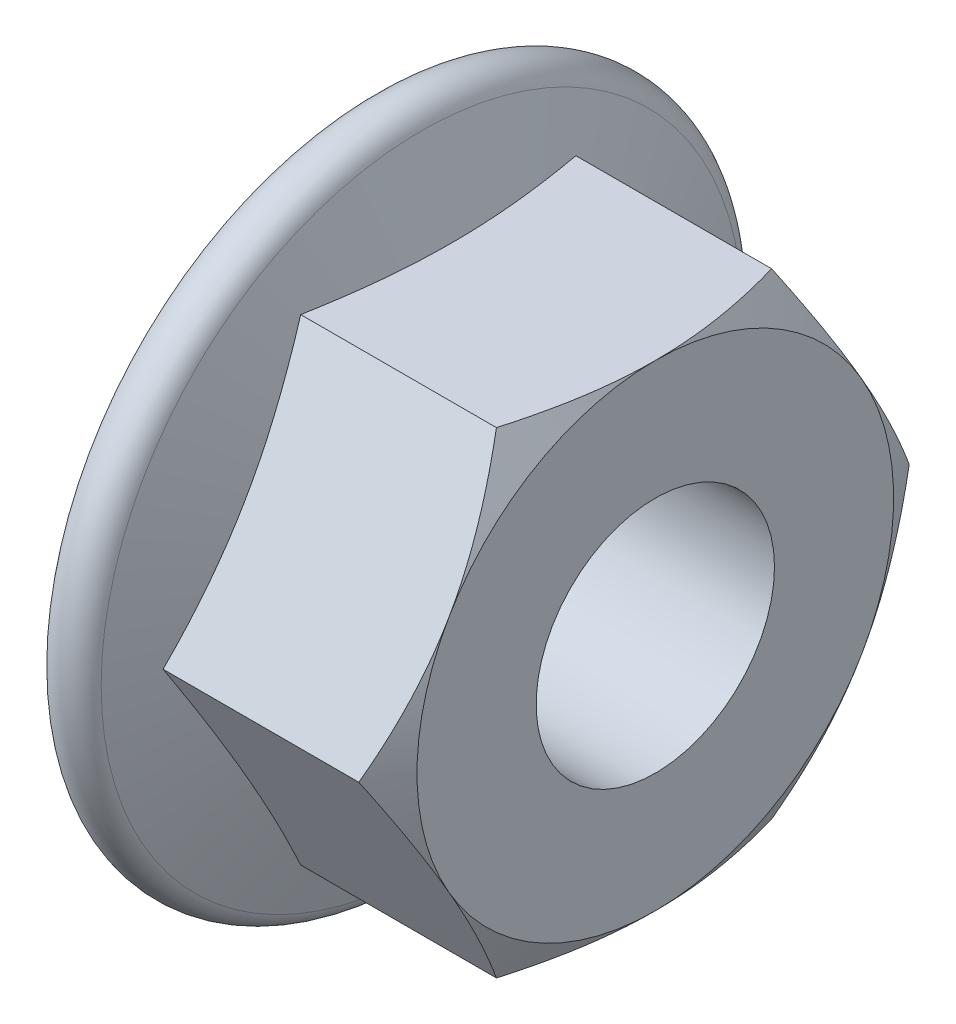
ISO-10303-21;
HEADER;
FILE_DESCRIPTION(('STEP AP214'),'2;1');
FILE_NAME('part.step','',(''),(''),'','','');
FILE_SCHEMA(('AUTOMOTIVE_DESIGN { 1 0 10303 214 1 1 1 1 }'));
ENDSEC;
DATA;
#1=APPLICATION_CONTEXT('core data for automotive mechanical design processes');
#2=APPLICATION_PROTOCOL_DEFINITION('international standard','automotive_design',2000,#1);
#3=PRODUCT_CONTEXT('',#1,'mechanical');
#4=PRODUCT('Part','Part','',(#3));
#5=PRODUCT_RELATED_PRODUCT_CATEGORY('part','',(#4));
#6=PRODUCT_DEFINITION_FORMATION('','',#4);
#7=PRODUCT_DEFINITION_CONTEXT('part definition',#1,'design');
#8=PRODUCT_DEFINITION('design','',#6,#7);
#9=PRODUCT_DEFINITION_SHAPE('','',#8);
#10=(LENGTH_UNIT() NAMED_UNIT(*) SI_UNIT(.MILLI.,.METRE.));
#11=(NAMED_UNIT(*) PLANE_ANGLE_UNIT() SI_UNIT($,.RADIAN.));
#12=(NAMED_UNIT(*) SI_UNIT($,.STERADIAN.) SOLID_ANGLE_UNIT());
#13=UNCERTAINTY_MEASURE_WITH_UNIT(LENGTH_MEASURE(1.E-05),#10,'distance_accuracy_value','');
#14=(GEOMETRIC_REPRESENTATION_CONTEXT(3) GLOBAL_UNCERTAINTY_ASSIGNED_CONTEXT((#13)) GLOBAL_UNIT_ASSIGNED_CONTEXT((#10,
#11,#12)) REPRESENTATION_CONTEXT('',''));
#15=CARTESIAN_POINT('',(0.,0.,0.));
#16=DIRECTION('',(0.,0.,1.));
#17=DIRECTION('',(1.,0.,0.));
#18=AXIS2_PLACEMENT_3D('',#15,#16,#17);
#19=CARTESIAN_POINT('',(6.,-5.,-2.88675134594813));
#20=DIRECTION('',(0.,0.5,0.866025403784439));
#21=DIRECTION('',(0.,-0.866025403784439,0.5));
#22=AXIS2_PLACEMENT_3D('',#19,#20,#21);
#23=PLANE('',#22);
#24=CARTESIAN_POINT('',(1.44695147787064,0.000200000000002036,-5.7736181619501));
#25=CARTESIAN_POINT('',(1.49048329927905,-0.206877460678997,-5.65406193428397));
#26=CARTESIAN_POINT('',(1.53008307358535,-0.414637787793837,-5.5341114534973));
#27=CARTESIAN_POINT('',(1.59975280945689,-0.831509364512721,-5.29343053646114));
#28=CARTESIAN_POINT('',(1.62981531333333,-1.04062154147157,-5.17269956480312));
#29=CARTESIAN_POINT('',(1.67844057362469,-1.45787607511845,-4.93179754748151));
#30=CARTESIAN_POINT('',(1.69710939255334,-1.66600890201676,-4.81163200384457));
#31=CARTESIAN_POINT('',(1.72214953135251,-2.08276129389805,-4.57101989820648));
#32=CARTESIAN_POINT('',(1.728525462769,-2.29138064694903,-4.45057345856434));
#33=CARTESIAN_POINT('',(1.728525462769,-2.70861935305097,-4.20968057928005));
#34=CARTESIAN_POINT('',(1.72214953135251,-2.91723870610194,-4.0892341396379));
#35=CARTESIAN_POINT('',(1.69710939255334,-3.33399109798324,-3.84862203399982));
#36=CARTESIAN_POINT('',(1.67844057362469,-3.54212392488155,-3.72845649036288));
#37=CARTESIAN_POINT('',(1.62981531333333,-3.95937845852842,-3.48755447304127));
#38=CARTESIAN_POINT('',(1.59975280945689,-4.16849063548728,-3.36682350138324));
#39=CARTESIAN_POINT('',(1.53008307358535,-4.58536221220616,-3.12614258434709));
#40=CARTESIAN_POINT('',(1.49048329927905,-4.793122539321,-3.00619210356042));
#41=CARTESIAN_POINT('',(1.44695147787064,-5.0002,-2.88663587589429));
#42=B_SPLINE_CURVE_WITH_KNOTS('',3,(#24,#25,#26,#27,#28,#29,#30,#31,#32,#33,#34,#35,#36,#37,#38,
#39,#40,#41),.UNSPECIFIED.,.F.,.F.,(4,2,2,2,2,2,2,2,4),(0.,0.729203512834577,1.45897583043699,
2.18184682225058,2.90444658389739,3.6270463455442,4.3499173373578,5.07968965496021,
5.80889316779478),.UNSPECIFIED.);
#43=CARTESIAN_POINT('',(1.44699350679399,0.,-5.77350269189626));
#44=VERTEX_POINT('',#43);
#45=CARTESIAN_POINT('',(1.44699350679399,-5.,-2.88675134594813));
#46=VERTEX_POINT('',#45);
#47=EDGE_CURVE('E50',#44,#46,#42,.T.);
#48=ORIENTED_EDGE('',*,*,#47,.F.);
#49=DIRECTION('',(-1.,0.,0.));
#50=VECTOR('',#49,1.);
#51=CARTESIAN_POINT('',(6.,0.,-5.77350269189626));
#52=LINE('',#51,#50);
#53=CARTESIAN_POINT('',(5.5534180126148,0.,-5.77350269189626));
#54=VERTEX_POINT('',#53);
#55=EDGE_CURVE('E11',#54,#44,#52,.T.);
#56=ORIENTED_EDGE('',*,*,#55,.F.);
#57=CARTESIAN_POINT('',(5.55335134394817,0.000200000000002,-5.7736181619501));
#58=CARTESIAN_POINT('',(5.62661343236236,-0.219534594525183,-5.64675433465071));
#59=CARTESIAN_POINT('',(5.69324867808191,-0.441148584459579,-5.5188054379059));
#60=CARTESIAN_POINT('',(5.80956100898919,-0.888213995453512,-5.26069210252318));
#61=CARTESIAN_POINT('',(5.85919695008421,-1.11367335959077,-5.13052307794721));
#62=CARTESIAN_POINT('',(5.9364489745813,-1.56183230522351,-4.87177839004641));
#63=CARTESIAN_POINT('',(5.96457962171651,-1.78446209310419,-4.74324302208387));
#64=CARTESIAN_POINT('',(5.98980507804632,-2.11918990184664,-4.54998783160116));
#65=CARTESIAN_POINT('',(5.99538654023052,-2.23084219680506,-4.48552534905128));
#66=CARTESIAN_POINT('',(6.00079778324853,-2.4542499706738,-4.35654081066911));
#67=CARTESIAN_POINT('',(6.0006277417418,-2.56600544629031,-4.2920187567385));
#68=CARTESIAN_POINT('',(5.99224636820796,-2.87218423085064,-4.11524635305244));
#69=CARTESIAN_POINT('',(5.97817022810275,-3.06650608596721,-4.00305457769146));
#70=CARTESIAN_POINT('',(5.93353474289057,-3.45386010199771,-3.77941563226457));
#71=CARTESIAN_POINT('',(5.90296013985249,-3.64689090137157,-3.66796924828419));
#72=CARTESIAN_POINT('',(5.82653150637884,-4.03502534247485,-3.44387972423144));
#73=CARTESIAN_POINT('',(5.78035362112132,-4.23007999864173,-3.3312648659868));
#74=CARTESIAN_POINT('',(5.67554820550807,-4.61728034535877,-3.10771464157941));
#75=CARTESIAN_POINT('',(5.61694529656263,-4.80943099540809,-2.99677641204847));
#76=CARTESIAN_POINT('',(5.55335134394817,-5.0002,-2.88663587589429));
#77=B_SPLINE_CURVE_WITH_KNOTS('',3,(#57,#58,#59,#60,#61,#62,#63,#64,#65,#66,#67,#68,#69,#70,#71,
#72,#73,#74,#75,#76),.UNSPECIFIED.,.F.,.F.,(4,2,2,2,2,2,2,2,2,4),(0.,0.79255584136309,
1.58701660053333,2.36181537487281,2.74884076077325,3.13585419177295,3.80962362599679,
4.48401723901189,5.17336882348928,5.86136694793725),.UNSPECIFIED.);
#78=CARTESIAN_POINT('',(6.,-2.5,-4.33012701892219));
#79=VERTEX_POINT('',#78);
#80=EDGE_CURVE('E373',#54,#79,#77,.T.);
#81=ORIENTED_EDGE('',*,*,#80,.T.);
#82=CARTESIAN_POINT('',(5.55341801261512,-5.,-2.88675134594862));
#83=VERTEX_POINT('',#82);
#84=EDGE_CURVE('E362',#79,#83,#77,.T.);
#85=ORIENTED_EDGE('',*,*,#84,.T.);
#86=DIRECTION('',(-1.,0.,0.));
#87=VECTOR('',#86,1.);
#88=CARTESIAN_POINT('',(6.,-5.,-2.88675134594813));
#89=LINE('',#88,#87);
#90=EDGE_CURVE('E119',#83,#46,#89,.T.);
#91=ORIENTED_EDGE('',*,*,#90,.T.);
#92=EDGE_LOOP('',(#48,#56,#81,#85,#91));
#93=FACE_BOUND('',#92,.T.);
#94=ADVANCED_FACE('F35',(#93),#23,.F.);
#95=CARTESIAN_POINT('',(6.,0.,-5.77350269189626));
#96=DIRECTION('',(0.,-0.5,0.866025403784438));
#97=DIRECTION('',(0.,-0.866025403784439,-0.5));
#98=AXIS2_PLACEMENT_3D('',#95,#96,#97);
#99=PLANE('',#98);
#100=CARTESIAN_POINT('',(1.44695147787064,5.0002,-2.88663587589429));
#101=CARTESIAN_POINT('',(1.49048329927905,4.793122539321,-3.00619210356041));
#102=CARTESIAN_POINT('',(1.53008307358535,4.58536221220616,-3.12614258434709));
#103=CARTESIAN_POINT('',(1.59975280945689,4.16849063548728,-3.36682350138324));
#104=CARTESIAN_POINT('',(1.62981531333333,3.95937845852842,-3.48755447304127));
#105=CARTESIAN_POINT('',(1.67844057362469,3.54212392488155,-3.72845649036288));
#106=CARTESIAN_POINT('',(1.69710939255334,3.33399109798324,-3.84862203399982));
#107=CARTESIAN_POINT('',(1.72214953135251,2.91723870610194,-4.0892341396379));
#108=CARTESIAN_POINT('',(1.728525462769,2.70861935305097,-4.20968057928005));
#109=CARTESIAN_POINT('',(1.728525462769,2.29138064694903,-4.45057345856434));
#110=CARTESIAN_POINT('',(1.72214953135251,2.08276129389806,-4.57101989820648));
#111=CARTESIAN_POINT('',(1.69710939255334,1.66600890201676,-4.81163200384457));
#112=CARTESIAN_POINT('',(1.67844057362469,1.45787607511845,-4.93179754748151));
#113=CARTESIAN_POINT('',(1.62981531333333,1.04062154147158,-5.17269956480312));
#114=CARTESIAN_POINT('',(1.59975280945689,0.831509364512725,-5.29343053646114));
#115=CARTESIAN_POINT('',(1.53008307358535,0.414637787793841,-5.53411145349729));
#116=CARTESIAN_POINT('',(1.49048329927905,0.206877460679002,-5.65406193428397));
#117=CARTESIAN_POINT('',(1.44695147787064,-0.000199999999997523,-5.7736181619501));
#118=B_SPLINE_CURVE_WITH_KNOTS('',3,(#100,#101,#102,#103,#104,#105,#106,#107,#108,#109,#110,
#111,#112,#113,#114,#115,#116,#117),.UNSPECIFIED.,.F.,.F.,(4,2,2,2,2,2,2,2,4),(0.,
0.729203512834577,1.45897583043699,2.18184682225058,2.90444658389739,3.6270463455442,
4.34991733735779,5.0796896549602,5.80889316779478),.UNSPECIFIED.);
#119=CARTESIAN_POINT('',(1.44699350679399,5.,-2.88675134594813));
#120=VERTEX_POINT('',#119);
#121=EDGE_CURVE('E56',#120,#44,#118,.T.);
#122=ORIENTED_EDGE('',*,*,#121,.F.);
#123=DIRECTION('',(-1.,0.,0.));
#124=VECTOR('',#123,1.);
#125=CARTESIAN_POINT('',(6.,5.,-2.88675134594813));
#126=LINE('',#125,#124);
#127=CARTESIAN_POINT('',(5.5534180126148,5.,-2.88675134594813));
#128=VERTEX_POINT('',#127);
#129=EDGE_CURVE('E43',#128,#120,#126,.T.);
#130=ORIENTED_EDGE('',*,*,#129,.F.);
#131=CARTESIAN_POINT('',(5.55335134394817,5.0002,-2.88663587589429));
#132=CARTESIAN_POINT('',(5.62661343236237,4.78046540547481,-3.01349970319368));
#133=CARTESIAN_POINT('',(5.69324867808191,4.55885141554042,-3.14144859993849));
#134=CARTESIAN_POINT('',(5.80956100898919,4.11178600454649,-3.39956193532121));
#135=CARTESIAN_POINT('',(5.85919695008421,3.88632664040923,-3.52973095989718));
#136=CARTESIAN_POINT('',(5.9364489745813,3.43816769477649,-3.78847564779798));
#137=CARTESIAN_POINT('',(5.96457962171651,3.21553790689581,-3.91701101576052));
#138=CARTESIAN_POINT('',(5.98980507804632,2.88081009815336,-4.11026620624322));
#139=CARTESIAN_POINT('',(5.99538654023052,2.76915780319494,-4.17472868879311));
#140=CARTESIAN_POINT('',(6.00079778324853,2.5457500293262,-4.30371322717528));
#141=CARTESIAN_POINT('',(6.0006277417418,2.43399455370969,-4.36823528110589));
#142=CARTESIAN_POINT('',(5.99224636820796,2.12781576914936,-4.54500768479194));
#143=CARTESIAN_POINT('',(5.97817022810275,1.93349391403279,-4.65719946015293));
#144=CARTESIAN_POINT('',(5.93353474289057,1.54613989800229,-4.88083840557981));
#145=CARTESIAN_POINT('',(5.90296013985249,1.35310909862843,-4.9922847895602));
#146=CARTESIAN_POINT('',(5.82653150637884,0.964974657525145,-5.21637431361295));
#147=CARTESIAN_POINT('',(5.78035362112132,0.769920001358264,-5.32898917185759));
#148=CARTESIAN_POINT('',(5.67554820550807,0.382719654641232,-5.55253939626498));
#149=CARTESIAN_POINT('',(5.61694529656263,0.190569004591914,-5.66347762579592));
#150=CARTESIAN_POINT('',(5.55335134394817,-0.000199999999999032,-5.7736181619501));
#151=B_SPLINE_CURVE_WITH_KNOTS('',3,(#131,#132,#133,#134,#135,#136,#137,#138,#139,#140,#141,
#142,#143,#144,#145,#146,#147,#148,#149,#150),.UNSPECIFIED.,.F.,.F.,(4,2,2,2,2,2,2,2,2,4),(0.,
0.792555841363091,1.58701660053333,2.36181537487281,2.74884076077325,3.13585419177295,
3.80962362599679,4.48401723901189,5.17336882348929,5.86136694793725),.UNSPECIFIED.);
#152=CARTESIAN_POINT('',(6.,2.5,-4.33012701892219));
#153=VERTEX_POINT('',#152);
#154=EDGE_CURVE('E360',#128,#153,#151,.T.);
#155=ORIENTED_EDGE('',*,*,#154,.T.);
#156=EDGE_CURVE('E356',#153,#54,#151,.T.);
#157=ORIENTED_EDGE('',*,*,#156,.T.);
#158=ORIENTED_EDGE('',*,*,#55,.T.);
#159=EDGE_LOOP('',(#122,#130,#155,#157,#158));
#160=FACE_BOUND('',#159,.T.);
#161=ADVANCED_FACE('F180',(#160),#99,.F.);
#162=CARTESIAN_POINT('',(6.,5.,-2.88675134594813));
#163=DIRECTION('',(0.,-1.,0.));
#164=DIRECTION('',(0.,0.,-1.));
#165=AXIS2_PLACEMENT_3D('',#162,#163,#164);
#166=PLANE('',#165);
#167=CARTESIAN_POINT('',(0.240410380733447,5.,-7.58959615984327));
#168=CARTESIAN_POINT('',(0.309005739965036,5.,-7.36384569298918));
#169=CARTESIAN_POINT('',(0.376788483884276,5.,-7.13784364484342));
#170=CARTESIAN_POINT('',(0.510278801993914,5.,-6.68520834285812));
#171=CARTESIAN_POINT('',(0.575986207460981,5.,-6.45857503931959));
#172=CARTESIAN_POINT('',(0.704987571615603,5.,-6.00415270868529));
#173=CARTESIAN_POINT('',(0.768276686874315,5.,-5.77636230158848));
#174=CARTESIAN_POINT('',(0.891686912335823,5.,-5.31992613831547));
#175=CARTESIAN_POINT('',(0.951808081104047,5.,-5.09128039803546));
#176=CARTESIAN_POINT('',(1.06731933712792,5.,-4.63605147199275));
#177=CARTESIAN_POINT('',(1.12276202276589,5.,-4.40948170004186));
#178=CARTESIAN_POINT('',(1.22884286746186,5.,-3.95522220866547));
#179=CARTESIAN_POINT('',(1.27948122516598,5.,-3.72753253595468));
#180=CARTESIAN_POINT('',(1.37476171635107,5.,-3.27096977405126));
#181=CARTESIAN_POINT('',(1.41940582815466,5.,-3.0420971013186));
#182=CARTESIAN_POINT('',(1.50132206790816,5.,-2.58302644184474));
#183=CARTESIAN_POINT('',(1.53859444868321,5.,-2.35282850083447));
#184=CARTESIAN_POINT('',(1.60055061253934,5.,-1.91709614149473));
#185=CARTESIAN_POINT('',(1.62617836997039,5.,-1.71169720602434));
#186=CARTESIAN_POINT('',(1.66938356038142,5.,-1.300047444084));
#187=CARTESIAN_POINT('',(1.68696123094219,5.,-1.09379664293629));
#188=CARTESIAN_POINT('',(1.71321907011135,5.,-0.680866570157189));
#189=CARTESIAN_POINT('',(1.72190551578435,5.,-0.474187704168648));
#190=CARTESIAN_POINT('',(1.72994348714457,5.,-0.0606464422863168));
#191=CARTESIAN_POINT('',(1.72929506312466,5.,0.146215952612682));
#192=CARTESIAN_POINT('',(1.71866806903133,5.,0.560887363316299));
#193=CARTESIAN_POINT('',(1.70863586762169,5.,0.768694982121785));
#194=CARTESIAN_POINT('',(1.67969487721076,5.,1.18368588091762));
#195=CARTESIAN_POINT('',(1.66078587096725,5.,1.39086914550323));
#196=CARTESIAN_POINT('',(1.61496450316448,5.,1.80451912755804));
#197=CARTESIAN_POINT('',(1.58804517468385,5.,2.01098506233829));
#198=CARTESIAN_POINT('',(1.52728003641189,5.,2.42288190162517));
#199=CARTESIAN_POINT('',(1.49343423871807,5.,2.6283128079389));
#200=CARTESIAN_POINT('',(1.41424688517568,5.,3.06963546378598));
#201=CARTESIAN_POINT('',(1.36793787152423,5.,3.30535232775187));
#202=CARTESIAN_POINT('',(1.26905627412394,5.,3.77547763257604));
#203=CARTESIAN_POINT('',(1.21648308868194,5.,4.00988594547648));
#204=CARTESIAN_POINT('',(1.10632504483254,5.,4.47760456738108));
#205=CARTESIAN_POINT('',(1.04873836254752,5.,4.71091444397109));
#206=CARTESIAN_POINT('',(0.929591136335446,5.,5.17650394783197));
#207=CARTESIAN_POINT('',(0.868030717162685,5.,5.40878360720176));
#208=CARTESIAN_POINT('',(0.741639900628577,5.,5.87282936457628));
#209=CARTESIAN_POINT('',(0.676804653050664,5.,6.10459413656035));
#210=CARTESIAN_POINT('',(0.544571006293116,5.,6.56739271981542));
#211=CARTESIAN_POINT('',(0.47717256801896,5.,6.79842651987916));
#212=CARTESIAN_POINT('',(0.271921216019188,5.,7.49050885313418));
#213=CARTESIAN_POINT('',(0.130983600487598,5.,7.95064170165435));
#214=CARTESIAN_POINT('',(-0.154327175359989,5.,8.86256175843402));
#215=CARTESIAN_POINT('',(-0.298621702234868,5.,9.31437377213064));
#216=CARTESIAN_POINT('',(-0.59098807599313,5.,10.2168017467589));
#217=CARTESIAN_POINT('',(-0.739060149445248,5.,10.6674176341516));
#218=CARTESIAN_POINT('',(-1.037285510531,5.,11.5658465543332));
#219=CARTESIAN_POINT('',(-1.18742737574142,5.,12.0136633895876));
#220=CARTESIAN_POINT('',(-1.48974192080514,5.,12.9085661933413));
#221=CARTESIAN_POINT('',(-1.64191441462424,5.,13.3556522246369));
#222=CARTESIAN_POINT('',(-1.79478683996488,5.,13.8024957314421));
#223=B_SPLINE_CURVE_WITH_KNOTS('',3,(#167,#168,#169,#170,#171,#172,#173,#174,#175,#176,#177,
#178,#179,#180,#181,#182,#183,#184,#185,#186,#187,#188,#189,#190,#191,#192,#193,#194,#195,#196,
#197,#198,#199,#200,#201,#202,#203,#204,#205,#206,#207,#208,#209,#210,#211,#212,#213,#214,#215,
#216,#217,#218,#219,#220,#221,#222),.UNSPECIFIED.,.F.,.F.,(4,2,2,2,2,2,2,2,2,2,2,2,2,2,2,2,2,2,
2,2,2,2,2,2,2,2,2,4),(0.,0.707830959157883,1.4157193170438,2.12495815770956,2.83418388216246,
3.53390660770378,4.23360038896179,4.93306267479613,5.63250096730801,6.25333796351582,
6.87415663589059,7.49453671714079,8.1149134560111,8.73885765625053,9.36281712708475,
9.98732087639871,10.6118235349877,11.3323825288529,12.0530107905286,12.7739023164102,
13.4947712211112,14.2167410100674,14.9387218151339,16.3823616315812,17.8052252158678,
19.2281743418802,20.645117438175,22.061931601778),.UNSPECIFIED.);
#224=CARTESIAN_POINT('',(1.44699350679399,5.,2.88675134594813));
#225=VERTEX_POINT('',#224);
#226=EDGE_CURVE('E167',#225,#120,#223,.F.);
#227=ORIENTED_EDGE('',*,*,#226,.F.);
#228=DIRECTION('',(-1.,0.,0.));
#229=VECTOR('',#228,1.);
#230=CARTESIAN_POINT('',(6.,5.,2.88675134594813));
#231=LINE('',#230,#229);
#232=CARTESIAN_POINT('',(5.5534180126148,5.,2.88675134594813));
#233=VERTEX_POINT('',#232);
#234=EDGE_CURVE('E387',#233,#225,#231,.T.);
#235=ORIENTED_EDGE('',*,*,#234,.F.);
#236=CARTESIAN_POINT('',(3.53606777790848,5.,-7.80316883937986));
#237=CARTESIAN_POINT('',(3.64243840063289,5.,-7.58429281451012));
#238=CARTESIAN_POINT('',(3.74780287408453,5.,-7.36491941565103));
#239=CARTESIAN_POINT('',(3.95595434118066,5.,-6.9249134028321));
#240=CARTESIAN_POINT('',(4.05874093737647,5.,-6.7042806010609));
#241=CARTESIAN_POINT('',(4.26167769321041,5.,-6.26037885537462));
#242=CARTESIAN_POINT('',(4.36181088826264,5.,-6.03710212934251));
#243=CARTESIAN_POINT('',(4.55804201425494,5.,-5.5887889667951));
#244=CARTESIAN_POINT('',(4.65414013303001,5.,-5.36375261277121));
#245=CARTESIAN_POINT('',(4.84425272269753,5.,-4.90427325796492));
#246=CARTESIAN_POINT('',(4.93810026031318,5.,-4.669760813791));
#247=CARTESIAN_POINT('',(5.11881045505089,5.,-4.19801090184383));
#248=CARTESIAN_POINT('',(5.20567233595843,5.,-3.96077313458294));
#249=CARTESIAN_POINT('',(5.37016800032486,5.,-3.48362276412448));
#250=CARTESIAN_POINT('',(5.44782000508509,5.,-3.24371650552178));
#251=CARTESIAN_POINT('',(5.59143735110183,5.,-2.76046376695176));
#252=CARTESIAN_POINT('',(5.65740631803894,5.,-2.51711837967746));
#253=CARTESIAN_POINT('',(5.77419170808293,5.,-2.02812819882913));
#254=CARTESIAN_POINT('',(5.82508725355427,5.,-1.78250265338299));
#255=CARTESIAN_POINT('',(5.9088543337547,5.,-1.28814793844047));
#256=CARTESIAN_POINT('',(5.94172780913601,5.,-1.0394191060634));
#257=CARTESIAN_POINT('',(5.98640065868094,5.,-0.543367110660337));
#258=CARTESIAN_POINT('',(5.99847475062826,5.,-0.296069313685915));
#259=CARTESIAN_POINT('',(6.00125141808879,5.,0.198673134405027));
#260=CARTESIAN_POINT('',(5.99195327307104,5.,0.446117790191489));
#261=CARTESIAN_POINT('',(5.958814524633,5.,0.864633163347569));
#262=CARTESIAN_POINT('',(5.94022876281716,5.,1.03614640079709));
#263=CARTESIAN_POINT('',(5.89391855067457,5.,1.37794285368106));
#264=CARTESIAN_POINT('',(5.86619290870596,5.,1.54822590576611));
#265=CARTESIAN_POINT('',(5.77076131034636,5.,2.05697626909056));
#266=CARTESIAN_POINT('',(5.69081596204524,5.,2.39317466210718));
#267=CARTESIAN_POINT('',(5.55180395744498,5.,2.89620716314616));
#268=CARTESIAN_POINT('',(5.50158447966445,5.,3.06563442620562));
#269=CARTESIAN_POINT('',(5.39584390367262,5.,3.40284249583916));
#270=CARTESIAN_POINT('',(5.3403227625058,5.,3.57062328906094));
#271=CARTESIAN_POINT('',(5.22487718771106,5.,3.90459478419822));
#272=CARTESIAN_POINT('',(5.16495403171503,5.,4.07078593178607));
#273=CARTESIAN_POINT('',(5.04141813967858,5.,4.40178114959466));
#274=CARTESIAN_POINT('',(4.97780551085333,5.,4.56658525996314));
#275=CARTESIAN_POINT('',(4.78868907584542,5.,5.04321761214102));
#276=CARTESIAN_POINT('',(4.65916015773458,5.,5.35344774258154));
#277=CARTESIAN_POINT('',(4.39212728338459,5.,5.97047015792695));
#278=CARTESIAN_POINT('',(4.25462221305608,5.,6.27726195539844));
#279=CARTESIAN_POINT('',(3.97369491093421,5.,6.88828788354801));
#280=CARTESIAN_POINT('',(3.83026995273225,5.,7.19252075628606));
#281=CARTESIAN_POINT('',(3.53904433414472,5.,7.79885706917929));
#282=CARTESIAN_POINT('',(3.391243906046,5.,8.10096062132632));
#283=CARTESIAN_POINT('',(3.09202137927656,5.,8.70405000320761));
#284=CARTESIAN_POINT('',(2.94059318273269,5.,9.00503280086994));
#285=CARTESIAN_POINT('',(2.63511968544861,5.,9.60566922109278));
#286=CARTESIAN_POINT('',(2.48107435573944,5.,9.90532282889419));
#287=CARTESIAN_POINT('',(2.17095664253258,5.,10.5034757206786));
#288=CARTESIAN_POINT('',(2.01488481543712,5.,10.8019752934812));
#289=CARTESIAN_POINT('',(1.70107767942472,5.,11.3980992373289));
#290=CARTESIAN_POINT('',(1.54334236440562,5.,11.6957236051584));
#291=CARTESIAN_POINT('',(1.10553891549485,5.,12.5172958294986));
#292=CARTESIAN_POINT('',(0.824050070420675,5.,13.0404863994554));
#293=CARTESIAN_POINT('',(0.25806272925609,5.,14.0852852868896));
#294=CARTESIAN_POINT('',(-0.0264359947545861,5.,14.6068934806386));
#295=CARTESIAN_POINT('',(-0.59661101789383,5.,15.6470173829691));
#296=CARTESIAN_POINT('',(-0.88227935894211,5.,16.1655374578931));
#297=CARTESIAN_POINT('',(-1.45528735907065,5.,17.2015921543189));
#298=CARTESIAN_POINT('',(-1.74262686397693,5.,17.7191268610575));
#299=CARTESIAN_POINT('',(-2.03056730926428,5.,18.2363247354929));
#300=B_SPLINE_CURVE_WITH_KNOTS('',3,(#236,#237,#238,#239,#240,#241,#242,#243,#244,#245,#246,
#247,#248,#249,#250,#251,#252,#253,#254,#255,#256,#257,#258,#259,#260,#261,#262,#263,#264,#265,
#266,#267,#268,#269,#270,#271,#272,#273,#274,#275,#276,#277,#278,#279,#280,#281,#282,#283,#284,
#285,#286,#287,#288,#289,#290,#291,#292,#293,#294,#295,#296,#297,#298,#299),.UNSPECIFIED.,.F.,
.F.,(4,2,2,2,2,2,2,2,2,2,2,2,2,2,2,2,2,2,2,2,2,2,2,2,2,2,2,2,2,2,2,4),(0.,0.730072267465859,
1.46025641161525,2.19433093555713,2.92837124996164,3.68606553214966,4.44384388990209,
5.2000970856125,5.9561151750262,6.70809147454211,7.45998678384695,8.20187268280229,
8.94378359362711,9.46108586718497,9.97845561241594,11.0137052032196,11.543798734101,
12.0738965603103,12.6038411352822,13.1337703179045,14.1421486511694,15.1506681729981,
16.1596574683085,17.1685932936781,18.1793640758274,19.1901460534587,20.2006561413383,
21.2111699373535,22.9934785699825,24.7759231462787,26.5519334185061,28.3277823640031),.UNSPECIFIED.);
#301=CARTESIAN_POINT('',(6.,5.,0.));
#302=VERTEX_POINT('',#301);
#303=EDGE_CURVE('E361',#233,#302,#300,.F.);
#304=ORIENTED_EDGE('',*,*,#303,.T.);
#305=EDGE_CURVE('E350',#302,#128,#300,.F.);
#306=ORIENTED_EDGE('',*,*,#305,.T.);
#307=ORIENTED_EDGE('',*,*,#129,.T.);
#308=EDGE_LOOP('',(#227,#235,#304,#306,#307));
#309=FACE_BOUND('',#308,.T.);
#310=ADVANCED_FACE('F183',(#309),#166,.F.);
#311=CARTESIAN_POINT('',(6.,5.,2.88675134594813));
#312=DIRECTION('',(0.,-0.5,-0.866025403784439));
#313=DIRECTION('',(0.,0.866025403784439,-0.5));
#314=AXIS2_PLACEMENT_3D('',#311,#312,#313);
#315=PLANE('',#314);
#316=CARTESIAN_POINT('',(1.44695147787064,-0.000200000000000837,5.7736181619501));
#317=CARTESIAN_POINT('',(1.49048329927905,0.206877460678998,5.65406193428397));
#318=CARTESIAN_POINT('',(1.53008307358535,0.414637787793838,5.53411145349729));
#319=CARTESIAN_POINT('',(1.59975280945689,0.831509364512722,5.29343053646114));
#320=CARTESIAN_POINT('',(1.62981531333333,1.04062154147157,5.17269956480312));
#321=CARTESIAN_POINT('',(1.67844057362469,1.45787607511845,4.93179754748151));
#322=CARTESIAN_POINT('',(1.69710939255334,1.66600890201676,4.81163200384457));
#323=CARTESIAN_POINT('',(1.72214953135251,2.08276129389805,4.57101989820648));
#324=CARTESIAN_POINT('',(1.728525462769,2.29138064694903,4.45057345856434));
#325=CARTESIAN_POINT('',(1.728525462769,2.70861935305097,4.20968057928005));
#326=CARTESIAN_POINT('',(1.72214953135251,2.91723870610194,4.0892341396379));
#327=CARTESIAN_POINT('',(1.69710939255334,3.33399109798324,3.84862203399982));
#328=CARTESIAN_POINT('',(1.67844057362469,3.54212392488155,3.72845649036288));
#329=CARTESIAN_POINT('',(1.62981531333333,3.95937845852842,3.48755447304127));
#330=CARTESIAN_POINT('',(1.59975280945689,4.16849063548728,3.36682350138324));
#331=CARTESIAN_POINT('',(1.53008307358535,4.58536221220616,3.12614258434709));
#332=CARTESIAN_POINT('',(1.49048329927905,4.793122539321,3.00619210356042));
#333=CARTESIAN_POINT('',(1.44695147787064,5.0002,2.88663587589429));
#334=B_SPLINE_CURVE_WITH_KNOTS('',3,(#316,#317,#318,#319,#320,#321,#322,#323,#324,#325,#326,
#327,#328,#329,#330,#331,#332,#333),.UNSPECIFIED.,.F.,.F.,(4,2,2,2,2,2,2,2,4),(0.,
0.729203512834577,1.45897583043699,2.18184682225058,2.90444658389739,3.6270463455442,
4.34991733735779,5.0796896549602,5.80889316779478),.UNSPECIFIED.);
#335=CARTESIAN_POINT('',(1.44699350679399,0.,5.77350269189626));
#336=VERTEX_POINT('',#335);
#337=EDGE_CURVE('E128',#336,#225,#334,.T.);
#338=ORIENTED_EDGE('',*,*,#337,.F.);
#339=DIRECTION('',(-1.,0.,0.));
#340=VECTOR('',#339,1.);
#341=CARTESIAN_POINT('',(6.,0.,5.77350269189626));
#342=LINE('',#341,#340);
#343=CARTESIAN_POINT('',(5.5534180126148,0.,5.77350269189626));
#344=VERTEX_POINT('',#343);
#345=EDGE_CURVE('E118',#344,#336,#342,.T.);
#346=ORIENTED_EDGE('',*,*,#345,.F.);
#347=CARTESIAN_POINT('',(5.55335134394817,-0.000200000000000837,5.7736181619501));
#348=CARTESIAN_POINT('',(5.62661343236237,0.219534594525184,5.64675433465071));
#349=CARTESIAN_POINT('',(5.69324867808191,0.44114858445958,5.5188054379059));
#350=CARTESIAN_POINT('',(5.80956100898919,0.888213995453513,5.26069210252318));
#351=CARTESIAN_POINT('',(5.85919695008421,1.11367335959077,5.13052307794721));
#352=CARTESIAN_POINT('',(5.9364489745813,1.56183230522351,4.87177839004641));
#353=CARTESIAN_POINT('',(5.96457962171651,1.78446209310419,4.74324302208387));
#354=CARTESIAN_POINT('',(5.98980507804632,2.11918990184664,4.54998783160116));
#355=CARTESIAN_POINT('',(5.99538654023052,2.23084219680506,4.48552534905128));
#356=CARTESIAN_POINT('',(6.00079778324853,2.4542499706738,4.35654081066911));
#357=CARTESIAN_POINT('',(6.0006277417418,2.56600544629031,4.2920187567385));
#358=CARTESIAN_POINT('',(5.99224636820796,2.87218423085064,4.11524635305244));
#359=CARTESIAN_POINT('',(5.97817022810275,3.06650608596721,4.00305457769146));
#360=CARTESIAN_POINT('',(5.93353474289057,3.45386010199771,3.77941563226457));
#361=CARTESIAN_POINT('',(5.90296013985249,3.64689090137157,3.66796924828418));
#362=CARTESIAN_POINT('',(5.82653150637884,4.03502534247485,3.44387972423144));
#363=CARTESIAN_POINT('',(5.78035362112132,4.23007999864174,3.3312648659868));
#364=CARTESIAN_POINT('',(5.67554820550807,4.61728034535877,3.1077146415794));
#365=CARTESIAN_POINT('',(5.61694529656263,4.80943099540809,2.99677641204847));
#366=CARTESIAN_POINT('',(5.55335134394817,5.0002,2.88663587589429));
#367=B_SPLINE_CURVE_WITH_KNOTS('',3,(#347,#348,#349,#350,#351,#352,#353,#354,#355,#356,#357,
#358,#359,#360,#361,#362,#363,#364,#365,#366),.UNSPECIFIED.,.F.,.F.,(4,2,2,2,2,2,2,2,2,4),(0.,
0.792555841363092,1.58701660053334,2.36181537487281,2.74884076077326,3.13585419177295,
3.80962362599679,4.48401723901189,5.17336882348929,5.86136694793725),.UNSPECIFIED.);
#368=CARTESIAN_POINT('',(6.,2.5,4.33012701892219));
#369=VERTEX_POINT('',#368);
#370=EDGE_CURVE('E399',#344,#369,#367,.T.);
#371=ORIENTED_EDGE('',*,*,#370,.T.);
#372=EDGE_CURVE('E344',#369,#233,#367,.T.);
#373=ORIENTED_EDGE('',*,*,#372,.T.);
#374=ORIENTED_EDGE('',*,*,#234,.T.);
#375=EDGE_LOOP('',(#338,#346,#371,#373,#374));
#376=FACE_BOUND('',#375,.T.);
#377=ADVANCED_FACE('F186',(#376),#315,.F.);
#378=CARTESIAN_POINT('',(6.,0.,5.77350269189626));
#379=DIRECTION('',(0.,0.5,-0.866025403784439));
#380=DIRECTION('',(0.,0.866025403784439,0.5));
#381=AXIS2_PLACEMENT_3D('',#378,#379,#380);
#382=PLANE('',#381);
#383=CARTESIAN_POINT('',(1.44695147787064,-5.0002,2.88663587589429));
#384=CARTESIAN_POINT('',(1.49048329927905,-4.793122539321,3.00619210356041));
#385=CARTESIAN_POINT('',(1.53008307358535,-4.58536221220616,3.12614258434709));
#386=CARTESIAN_POINT('',(1.59975280945689,-4.16849063548728,3.36682350138324));
#387=CARTESIAN_POINT('',(1.62981531333333,-3.95937845852842,3.48755447304127));
#388=CARTESIAN_POINT('',(1.67844057362469,-3.54212392488155,3.72845649036288));
#389=CARTESIAN_POINT('',(1.69710939255334,-3.33399109798324,3.84862203399982));
#390=CARTESIAN_POINT('',(1.72214953135251,-2.91723870610194,4.0892341396379));
#391=CARTESIAN_POINT('',(1.728525462769,-2.70861935305097,4.20968057928005));
#392=CARTESIAN_POINT('',(1.728525462769,-2.29138064694903,4.45057345856434));
#393=CARTESIAN_POINT('',(1.72214953135251,-2.08276129389806,4.57101989820648));
#394=CARTESIAN_POINT('',(1.69710939255334,-1.66600890201676,4.81163200384457));
#395=CARTESIAN_POINT('',(1.67844057362469,-1.45787607511845,4.93179754748151));
#396=CARTESIAN_POINT('',(1.62981531333333,-1.04062154147158,5.17269956480312));
#397=CARTESIAN_POINT('',(1.59975280945689,-0.831509364512724,5.29343053646114));
#398=CARTESIAN_POINT('',(1.53008307358535,-0.41463778779384,5.53411145349729));
#399=CARTESIAN_POINT('',(1.49048329927905,-0.206877460679001,5.65406193428397));
#400=CARTESIAN_POINT('',(1.44695147787064,0.000199999999998413,5.77361816195009));
#401=B_SPLINE_CURVE_WITH_KNOTS('',3,(#383,#384,#385,#386,#387,#388,#389,#390,#391,#392,#393,
#394,#395,#396,#397,#398,#399,#400),.UNSPECIFIED.,.F.,.F.,(4,2,2,2,2,2,2,2,4),(0.,
0.729203512834578,1.45897583043699,2.18184682225058,2.90444658389739,3.6270463455442,
4.34991733735779,5.0796896549602,5.80889316779478),.UNSPECIFIED.);
#402=CARTESIAN_POINT('',(1.44699350679399,-5.,2.88675134594813));
#403=VERTEX_POINT('',#402);
#404=EDGE_CURVE('E123',#403,#336,#401,.T.);
#405=ORIENTED_EDGE('',*,*,#404,.F.);
#406=DIRECTION('',(-1.,0.,0.));
#407=VECTOR('',#406,1.);
#408=CARTESIAN_POINT('',(6.,-5.,2.88675134594813));
#409=LINE('',#408,#407);
#410=CARTESIAN_POINT('',(5.5534180126148,-5.,2.88675134594813));
#411=VERTEX_POINT('',#410);
#412=EDGE_CURVE('E107',#411,#403,#409,.T.);
#413=ORIENTED_EDGE('',*,*,#412,.F.);
#414=CARTESIAN_POINT('',(5.55335134394817,-5.0002,2.88663587589429));
#415=CARTESIAN_POINT('',(5.62661343236237,-4.78046540547481,3.01349970319368));
#416=CARTESIAN_POINT('',(5.69324867808191,-4.55885141554042,3.14144859993849));
#417=CARTESIAN_POINT('',(5.80956100898919,-4.11178600454649,3.39956193532121));
#418=CARTESIAN_POINT('',(5.85919695008421,-3.88632664040923,3.52973095989718));
#419=CARTESIAN_POINT('',(5.9364489745813,-3.43816769477649,3.78847564779798));
#420=CARTESIAN_POINT('',(5.96457962171651,-3.21553790689581,3.91701101576052));
#421=CARTESIAN_POINT('',(5.98980507804632,-2.88081009815336,4.11026620624322));
#422=CARTESIAN_POINT('',(5.99538654023052,-2.76915780319494,4.17472868879311));
#423=CARTESIAN_POINT('',(6.00079778324853,-2.5457500293262,4.30371322717528));
#424=CARTESIAN_POINT('',(6.0006277417418,-2.43399455370969,4.36823528110589));
#425=CARTESIAN_POINT('',(5.99224636820796,-2.12781576914936,4.54500768479194));
#426=CARTESIAN_POINT('',(5.97817022810275,-1.93349391403279,4.65719946015292));
#427=CARTESIAN_POINT('',(5.93353474289057,-1.54613989800229,4.88083840557981));
#428=CARTESIAN_POINT('',(5.90296013985249,-1.35310909862843,4.9922847895602));
#429=CARTESIAN_POINT('',(5.82653150637884,-0.964974657525145,5.21637431361295));
#430=CARTESIAN_POINT('',(5.78035362112132,-0.769920001358264,5.32898917185759));
#431=CARTESIAN_POINT('',(5.67554820550807,-0.382719654641232,5.55253939626498));
#432=CARTESIAN_POINT('',(5.61694529656263,-0.190569004591913,5.66347762579592));
#433=CARTESIAN_POINT('',(5.55335134394817,0.000199999999999368,5.7736181619501));
#434=B_SPLINE_CURVE_WITH_KNOTS('',3,(#414,#415,#416,#417,#418,#419,#420,#421,#422,#423,#424,
#425,#426,#427,#428,#429,#430,#431,#432,#433),.UNSPECIFIED.,.F.,.F.,(4,2,2,2,2,2,2,2,2,4),(0.,
0.792555841363091,1.58701660053333,2.36181537487281,2.74884076077325,3.13585419177295,
3.80962362599679,4.48401723901189,5.17336882348928,5.86136694793725),.UNSPECIFIED.);
#435=CARTESIAN_POINT('',(6.,-2.5,4.33012701892219));
#436=VERTEX_POINT('',#435);
#437=EDGE_CURVE('E400',#411,#436,#434,.T.);
#438=ORIENTED_EDGE('',*,*,#437,.T.);
#439=EDGE_CURVE('E337',#436,#344,#434,.T.);
#440=ORIENTED_EDGE('',*,*,#439,.T.);
#441=ORIENTED_EDGE('',*,*,#345,.T.);
#442=EDGE_LOOP('',(#405,#413,#438,#440,#441));
#443=FACE_BOUND('',#442,.T.);
#444=ADVANCED_FACE('F124',(#443),#382,.F.);
#445=CARTESIAN_POINT('',(6.,-5.,2.88675134594813));
#446=DIRECTION('',(0.,1.,0.));
#447=DIRECTION('',(0.,0.,1.));
#448=AXIS2_PLACEMENT_3D('',#445,#446,#447);
#449=PLANE('',#448);
#450=CARTESIAN_POINT('',(0.240410380749519,-5.,-7.58959615979039));
#451=CARTESIAN_POINT('',(0.309005739980342,-5.,-7.36384569293835));
#452=CARTESIAN_POINT('',(0.376788483898816,-5.,-7.13784364479464));
#453=CARTESIAN_POINT('',(0.510278802006934,-5.,-6.68520834281344));
#454=CARTESIAN_POINT('',(0.575986207473244,-5.,-6.45857503927697));
#455=CARTESIAN_POINT('',(0.704987571626366,-5.,-6.0041527086468));
#456=CARTESIAN_POINT('',(0.768276686884333,-5.,-5.77636230155206));
#457=CARTESIAN_POINT('',(0.891686912344374,-5.,-5.31992613828321));
#458=CARTESIAN_POINT('',(0.951808081111877,-5.,-5.09128039800528));
#459=CARTESIAN_POINT('',(1.06731933713435,-5.,-4.63605147196672));
#460=CARTESIAN_POINT('',(1.12276202277165,-5.,-4.4094817000179));
#461=CARTESIAN_POINT('',(1.22884286746633,-5.,-3.95522220864565));
#462=CARTESIAN_POINT('',(1.27948122516982,-5.,-3.72753253593694));
#463=CARTESIAN_POINT('',(1.37476171635376,-5.,-3.2709697740377));
#464=CARTESIAN_POINT('',(1.41940582815681,-5.,-3.04209710130712));
#465=CARTESIAN_POINT('',(1.50132206790935,-5.,-2.58302644183749));
#466=CARTESIAN_POINT('',(1.53859444868398,-5.,-2.35282850082934));
#467=CARTESIAN_POINT('',(1.6005506125398,-5.,-1.91709614149124));
#468=CARTESIAN_POINT('',(1.62617836997087,-5.,-1.71169720602037));
#469=CARTESIAN_POINT('',(1.66938356038188,-5.,-1.30004744407905));
#470=CARTESIAN_POINT('',(1.68696123094262,-5.,-1.09379664293085));
#471=CARTESIAN_POINT('',(1.71321907011168,-5.,-0.680866570150772));
#472=CARTESIAN_POINT('',(1.72190551578459,-5.,-0.474187704161743));
#473=CARTESIAN_POINT('',(1.72994348714461,-5.,-0.0606464422784395));
#474=CARTESIAN_POINT('',(1.72929506312458,-5.,0.146215952621044));
#475=CARTESIAN_POINT('',(1.71866806903095,-5.,0.560887363325643));
#476=CARTESIAN_POINT('',(1.70863586762115,-5.,0.768694982131627));
#477=CARTESIAN_POINT('',(1.67969487720986,-5.,1.18368588092844));
#478=CARTESIAN_POINT('',(1.66078587096615,-5.,1.39086914551455));
#479=CARTESIAN_POINT('',(1.61496450316297,-5.,1.80451912757033));
#480=CARTESIAN_POINT('',(1.58804517468212,-5.,2.01098506235107));
#481=CARTESIAN_POINT('',(1.52728003640971,-5.,2.42288190163891));
#482=CARTESIAN_POINT('',(1.49343423871566,-5.,2.62831280795311));
#483=CARTESIAN_POINT('',(1.41424688517288,-5.,3.06963546380067));
#484=CARTESIAN_POINT('',(1.36793787152127,-5.,3.30535232776657));
#485=CARTESIAN_POINT('',(1.26905627412071,-5.,3.77547763259076));
#486=CARTESIAN_POINT('',(1.21648308867858,-5.,4.0098859454912));
#487=CARTESIAN_POINT('',(1.10632504482895,-5.,4.47760456739583));
#488=CARTESIAN_POINT('',(1.04873836254384,-5.,4.71091444398585));
#489=CARTESIAN_POINT('',(0.929591136331571,-5.,5.17650394784675));
#490=CARTESIAN_POINT('',(0.868030717158726,-5.,5.40878360721656));
#491=CARTESIAN_POINT('',(0.741639900624465,-5.,5.87282936459111));
#492=CARTESIAN_POINT('',(0.676804653046483,-5.,6.10459413657519));
#493=CARTESIAN_POINT('',(0.544571006288808,-5.,6.56739271983029));
#494=CARTESIAN_POINT('',(0.477172568014594,-5.,6.79842651989405));
#495=CARTESIAN_POINT('',(0.271921216014661,-5.,7.49050885314911));
#496=CARTESIAN_POINT('',(0.130983600482982,-5.,7.95064170166932));
#497=CARTESIAN_POINT('',(-0.154327175364704,-5.,8.86256175844888));
#498=CARTESIAN_POINT('',(-0.298621702239591,-5.,9.31437377214535));
#499=CARTESIAN_POINT('',(-0.590988075997849,-5.,10.2168017467734));
#500=CARTESIAN_POINT('',(-0.739060149449958,-5.,10.6674176341659));
#501=CARTESIAN_POINT('',(-1.03728551053568,-5.,11.5658465543472));
#502=CARTESIAN_POINT('',(-1.1874273757461,-5.,12.0136633896015));
#503=CARTESIAN_POINT('',(-1.48974192080979,-5.,12.908566193355));
#504=CARTESIAN_POINT('',(-1.64191441462887,-5.,13.3556522246505));
#505=CARTESIAN_POINT('',(-1.79478683996948,-5.,13.8024957314555));
#506=B_SPLINE_CURVE_WITH_KNOTS('',3,(#450,#451,#452,#453,#454,#455,#456,#457,#458,#459,#460,
#461,#462,#463,#464,#465,#466,#467,#468,#469,#470,#471,#472,#473,#474,#475,#476,#477,#478,#479,
#480,#481,#482,#483,#484,#485,#486,#487,#488,#489,#490,#491,#492,#493,#494,#495,#496,#497,#498,
#499,#500,#501,#502,#503,#504,#505),.UNSPECIFIED.,.F.,.F.,(4,2,2,2,2,2,2,2,2,2,2,2,2,2,2,2,2,2,
2,2,2,2,2,2,2,2,2,4),(0.,0.707830959151331,1.4157193170307,2.12495815768986,2.83418388213617,
3.533906607671,4.23360038892251,4.93306267475037,5.63250096725578,6.25333796346504,
6.87415663584126,7.49453671709292,8.11491345596468,8.73885765620563,9.36281712704136,
9.98732087635684,10.6118235349473,11.3323825288127,12.0530107904885,12.7739023163702,
13.4947712210713,14.2167410100276,14.9387218150942,16.3823616315416,17.8052252158278,
19.2281743418398,20.6451174381343,22.0619316017369),.UNSPECIFIED.);
#507=EDGE_CURVE('E111',#46,#403,#506,.T.);
#508=ORIENTED_EDGE('',*,*,#507,.F.);
#509=ORIENTED_EDGE('',*,*,#90,.F.);
#510=CARTESIAN_POINT('',(3.53606777790848,-5.,-7.80316883937987));
#511=CARTESIAN_POINT('',(3.64243840063289,-5.,-7.58429281451013));
#512=CARTESIAN_POINT('',(3.74780287408453,-5.,-7.36491941565103));
#513=CARTESIAN_POINT('',(3.95595434118066,-5.,-6.9249134028321));
#514=CARTESIAN_POINT('',(4.05874093737647,-5.,-6.7042806010609));
#515=CARTESIAN_POINT('',(4.2616776932104,-5.,-6.26037885537462));
#516=CARTESIAN_POINT('',(4.36181088826263,-5.,-6.03710212934252));
#517=CARTESIAN_POINT('',(4.55804201425494,-5.,-5.58878896679511));
#518=CARTESIAN_POINT('',(4.65414013303001,-5.,-5.36375261277121));
#519=CARTESIAN_POINT('',(4.84425272269752,-5.,-4.90427325796493));
#520=CARTESIAN_POINT('',(4.93810026031318,-5.,-4.669760813791));
#521=CARTESIAN_POINT('',(5.11881045505089,-5.,-4.19801090184383));
#522=CARTESIAN_POINT('',(5.20567233595843,-5.,-3.96077313458295));
#523=CARTESIAN_POINT('',(5.37016800032486,-5.,-3.48362276412448));
#524=CARTESIAN_POINT('',(5.44782000508509,-5.,-3.24371650552178));
#525=CARTESIAN_POINT('',(5.59143735110182,-5.,-2.76046376695176));
#526=CARTESIAN_POINT('',(5.65740631803894,-5.,-2.51711837967746));
#527=CARTESIAN_POINT('',(5.77419170808293,-5.,-2.02812819882913));
#528=CARTESIAN_POINT('',(5.82508725355427,-5.,-1.78250265338299));
#529=CARTESIAN_POINT('',(5.9088543337547,-5.,-1.28814793844047));
#530=CARTESIAN_POINT('',(5.94172780913601,-5.,-1.0394191060634));
#531=CARTESIAN_POINT('',(5.98640065868094,-5.,-0.543367110660338));
#532=CARTESIAN_POINT('',(5.99847475062826,-5.,-0.296069313685917));
#533=CARTESIAN_POINT('',(6.00125141808879,-5.,0.198673134405025));
#534=CARTESIAN_POINT('',(5.99195327307104,-5.,0.446117790191488));
#535=CARTESIAN_POINT('',(5.95881452463299,-5.,0.864633163347567));
#536=CARTESIAN_POINT('',(5.94022876281716,-5.,1.03614640079709));
#537=CARTESIAN_POINT('',(5.89391855067457,-5.,1.37794285368106));
#538=CARTESIAN_POINT('',(5.86619290870596,-5.,1.54822590576611));
#539=CARTESIAN_POINT('',(5.77076131034636,-5.,2.05697626909056));
#540=CARTESIAN_POINT('',(5.69081596204524,-5.,2.39317466210718));
#541=CARTESIAN_POINT('',(5.55180395744498,-5.,2.89620716314616));
#542=CARTESIAN_POINT('',(5.50158447966445,-5.,3.06563442620562));
#543=CARTESIAN_POINT('',(5.39584390367263,-5.,3.40284249583916));
#544=CARTESIAN_POINT('',(5.3403227625058,-5.,3.57062328906094));
#545=CARTESIAN_POINT('',(5.22487718771106,-5.,3.90459478419822));
#546=CARTESIAN_POINT('',(5.16495403171503,-5.,4.07078593178607));
#547=CARTESIAN_POINT('',(5.04141813967858,-5.,4.40178114959466));
#548=CARTESIAN_POINT('',(4.97780551085333,-5.,4.56658525996314));
#549=CARTESIAN_POINT('',(4.78868907584542,-5.,5.04321761214102));
#550=CARTESIAN_POINT('',(4.65916015773458,-5.,5.35344774258154));
#551=CARTESIAN_POINT('',(4.39212728338459,-5.,5.97047015792695));
#552=CARTESIAN_POINT('',(4.25462221305608,-5.,6.27726195539844));
#553=CARTESIAN_POINT('',(3.97369491093421,-5.,6.88828788354801));
#554=CARTESIAN_POINT('',(3.83026995273225,-5.,7.19252075628606));
#555=CARTESIAN_POINT('',(3.53904433414472,-5.,7.79885706917929));
#556=CARTESIAN_POINT('',(3.391243906046,-5.,8.10096062132632));
#557=CARTESIAN_POINT('',(3.09202137927656,-5.,8.7040500032076));
#558=CARTESIAN_POINT('',(2.9405931827327,-5.,9.00503280086993));
#559=CARTESIAN_POINT('',(2.63511968544861,-5.,9.60566922109278));
#560=CARTESIAN_POINT('',(2.48107435573944,-5.,9.90532282889419));
#561=CARTESIAN_POINT('',(2.17095664253258,-5.,10.5034757206786));
#562=CARTESIAN_POINT('',(2.01488481543712,-5.,10.8019752934812));
#563=CARTESIAN_POINT('',(1.70107767942472,-5.,11.3980992373289));
#564=CARTESIAN_POINT('',(1.54334236440562,-5.,11.6957236051584));
#565=CARTESIAN_POINT('',(1.10553891549484,-5.,12.5172958294986));
#566=CARTESIAN_POINT('',(0.824050070420674,-5.,13.0404863994554));
#567=CARTESIAN_POINT('',(0.258062729256092,-5.,14.0852852868896));
#568=CARTESIAN_POINT('',(-0.0264359947545848,-5.,14.6068934806386));
#569=CARTESIAN_POINT('',(-0.596611017893829,-5.,15.6470173829691));
#570=CARTESIAN_POINT('',(-0.88227935894211,-5.,16.1655374578931));
#571=CARTESIAN_POINT('',(-1.45528735907065,-5.,17.2015921543189));
#572=CARTESIAN_POINT('',(-1.74262686397693,-5.,17.7191268610575));
#573=CARTESIAN_POINT('',(-2.03056730926428,-5.,18.2363247354929));
#574=B_SPLINE_CURVE_WITH_KNOTS('',3,(#510,#511,#512,#513,#514,#515,#516,#517,#518,#519,#520,
#521,#522,#523,#524,#525,#526,#527,#528,#529,#530,#531,#532,#533,#534,#535,#536,#537,#538,#539,
#540,#541,#542,#543,#544,#545,#546,#547,#548,#549,#550,#551,#552,#553,#554,#555,#556,#557,#558,
#559,#560,#561,#562,#563,#564,#565,#566,#567,#568,#569,#570,#571,#572,#573),.UNSPECIFIED.,.F.,
.F.,(4,2,2,2,2,2,2,2,2,2,2,2,2,2,2,2,2,2,2,2,2,2,2,2,2,2,2,2,2,2,2,4),(0.,0.730072267465859,
1.46025641161524,2.19433093555713,2.92837124996164,3.68606553214966,4.44384388990209,
5.20009708561249,5.9561151750262,6.70809147454211,7.45998678384695,8.20187268280229,
8.94378359362711,9.46108586718497,9.97845561241594,11.0137052032196,11.543798734101,
12.0738965603103,12.6038411352822,13.1337703179045,14.1421486511694,15.1506681729981,
16.1596574683085,17.1685932936781,18.1793640758274,19.1901460534587,20.2006561413383,
21.2111699373535,22.9934785699825,24.7759231462787,26.5519334185061,28.3277823640031),.UNSPECIFIED.);
#575=CARTESIAN_POINT('',(6.,-5.,0.));
#576=VERTEX_POINT('',#575);
#577=EDGE_CURVE('E402',#83,#576,#574,.T.);
#578=ORIENTED_EDGE('',*,*,#577,.T.);
#579=EDGE_CURVE('E114',#576,#411,#574,.T.);
#580=ORIENTED_EDGE('',*,*,#579,.T.);
#581=ORIENTED_EDGE('',*,*,#412,.T.);
#582=EDGE_LOOP('',(#508,#509,#578,#580,#581));
#583=FACE_BOUND('',#582,.T.);
#584=ADVANCED_FACE('F109',(#583),#449,.F.);
#585=CARTESIAN_POINT('',(6.,-5.,-2.88675134594813));
#586=DIRECTION('',(-1.,0.,0.));
#587=DIRECTION('',(0.,0.,1.));
#588=AXIS2_PLACEMENT_3D('',#585,#586,#587);
#589=PLANE('',#588);
#590=CARTESIAN_POINT('',(6.,0.,0.));
#591=DIRECTION('',(1.,0.,0.));
#592=DIRECTION('',(0.,0.,-1.));
#593=AXIS2_PLACEMENT_3D('',#590,#591,#592);
#594=CIRCLE('',#593,5.);
#595=EDGE_CURVE('E378',#302,#369,#594,.T.);
#596=ORIENTED_EDGE('',*,*,#595,.T.);
#597=EDGE_CURVE('E412',#369,#436,#594,.T.);
#598=ORIENTED_EDGE('',*,*,#597,.T.);
#599=EDGE_CURVE('E407',#436,#576,#594,.T.);
#600=ORIENTED_EDGE('',*,*,#599,.T.);
#601=EDGE_CURVE('E409',#576,#79,#594,.T.);
#602=ORIENTED_EDGE('',*,*,#601,.T.);
#603=EDGE_CURVE('E379',#79,#153,#594,.T.);
#604=ORIENTED_EDGE('',*,*,#603,.T.);
#605=EDGE_CURVE('E374',#153,#302,#594,.T.);
#606=ORIENTED_EDGE('',*,*,#605,.T.);
#607=EDGE_LOOP('',(#596,#598,#600,#602,#604,#606));
#608=FACE_BOUND('',#607,.T.);
#609=CARTESIAN_POINT('',(6.,0.,0.));
#610=DIRECTION('',(1.,0.,0.));
#611=DIRECTION('',(0.,0.,-1.));
#612=AXIS2_PLACEMENT_3D('',#609,#610,#611);
#613=CIRCLE('',#612,2.5);
#614=CARTESIAN_POINT('',(6.,0.,-2.5));
#615=VERTEX_POINT('',#614);
#616=EDGE_CURVE('E380',#615,#615,#613,.T.);
#617=ORIENTED_EDGE('',*,*,#616,.F.);
#618=EDGE_LOOP('',(#617));
#619=FACE_BOUND('',#618,.T.);
#620=ADVANCED_FACE('F196',(#608,#619),#589,.F.);
#621=CARTESIAN_POINT('',(0.,-5.,-2.88675134594813));
#622=DIRECTION('',(-1.,0.,0.));
#623=DIRECTION('',(0.,0.,1.));
#624=AXIS2_PLACEMENT_3D('',#621,#622,#623);
#625=PLANE('',#624);
#626=CARTESIAN_POINT('',(0.,0.,0.));
#627=DIRECTION('',(1.,0.,0.));
#628=DIRECTION('',(0.,0.,-1.));
#629=AXIS2_PLACEMENT_3D('',#626,#627,#628);
#630=CIRCLE('',#629,2.5);
#631=CARTESIAN_POINT('',(0.,0.,-2.5));
#632=VERTEX_POINT('',#631);
#633=EDGE_CURVE('E377',#632,#632,#630,.T.);
#634=ORIENTED_EDGE('',*,*,#633,.T.);
#635=EDGE_LOOP('',(#634));
#636=FACE_BOUND('',#635,.T.);
#637=CARTESIAN_POINT('',(0.,0.,0.));
#638=DIRECTION('',(-1.,0.,0.));
#639=DIRECTION('',(0.,0.,1.));
#640=AXIS2_PLACEMENT_3D('',#637,#638,#639);
#641=CIRCLE('',#640,6.53289983773083);
#642=CARTESIAN_POINT('',(0.,0.,6.53289983773083));
#643=VERTEX_POINT('',#642);
#644=EDGE_CURVE('E134',#643,#643,#641,.T.);
#645=ORIENTED_EDGE('',*,*,#644,.T.);
#646=EDGE_LOOP('',(#645));
#647=FACE_BOUND('',#646,.T.);
#648=ADVANCED_FACE('F230',(#636,#647),#625,.T.);
#649=CARTESIAN_POINT('',(6.,0.,0.));
#650=DIRECTION('',(-1.,0.,0.));
#651=DIRECTION('',(0.,0.,1.));
#652=AXIS2_PLACEMENT_3D('',#649,#650,#651);
#653=CYLINDRICAL_SURFACE('',#652,2.5);
#654=ORIENTED_EDGE('',*,*,#633,.F.);
#655=EDGE_LOOP('',(#654));
#656=FACE_BOUND('',#655,.T.);
#657=ORIENTED_EDGE('',*,*,#616,.T.);
#658=EDGE_LOOP('',(#657));
#659=FACE_BOUND('',#658,.T.);
#660=ADVANCED_FACE('F235',(#656,#659),#653,.F.);
#661=CARTESIAN_POINT('',(6.,0.,0.));
#662=DIRECTION('',(-1.,0.,0.));
#663=DIRECTION('',(0.,0.,-1.));
#664=AXIS2_PLACEMENT_3D('',#661,#662,#663);
#665=CONICAL_SURFACE('',#664,5.,1.0471975511966);
#666=ORIENTED_EDGE('',*,*,#437,.F.);
#667=ORIENTED_EDGE('',*,*,#579,.F.);
#668=ORIENTED_EDGE('',*,*,#599,.F.);
#669=EDGE_LOOP('',(#666,#667,#668));
#670=FACE_BOUND('',#669,.T.);
#671=ADVANCED_FACE('F247',(#670),#665,.T.);
#672=ORIENTED_EDGE('',*,*,#84,.F.);
#673=ORIENTED_EDGE('',*,*,#601,.F.);
#674=ORIENTED_EDGE('',*,*,#577,.F.);
#675=EDGE_LOOP('',(#672,#673,#674));
#676=FACE_BOUND('',#675,.T.);
#677=ADVANCED_FACE('F295',(#676),#665,.T.);
#678=ORIENTED_EDGE('',*,*,#370,.F.);
#679=ORIENTED_EDGE('',*,*,#439,.F.);
#680=ORIENTED_EDGE('',*,*,#597,.F.);
#681=EDGE_LOOP('',(#678,#679,#680));
#682=FACE_BOUND('',#681,.T.);
#683=ADVANCED_FACE('F277',(#682),#665,.T.);
#684=ORIENTED_EDGE('',*,*,#303,.F.);
#685=ORIENTED_EDGE('',*,*,#372,.F.);
#686=ORIENTED_EDGE('',*,*,#595,.F.);
#687=EDGE_LOOP('',(#684,#685,#686));
#688=FACE_BOUND('',#687,.T.);
#689=ADVANCED_FACE('F282',(#688),#665,.T.);
#690=ORIENTED_EDGE('',*,*,#305,.F.);
#691=ORIENTED_EDGE('',*,*,#605,.F.);
#692=ORIENTED_EDGE('',*,*,#154,.F.);
#693=EDGE_LOOP('',(#690,#691,#692));
#694=FACE_BOUND('',#693,.T.);
#695=ADVANCED_FACE('F274',(#694),#665,.T.);
#696=ORIENTED_EDGE('',*,*,#156,.F.);
#697=ORIENTED_EDGE('',*,*,#603,.F.);
#698=ORIENTED_EDGE('',*,*,#80,.F.);
#699=EDGE_LOOP('',(#696,#697,#698));
#700=FACE_BOUND('',#699,.T.);
#701=ADVANCED_FACE('F153',(#700),#665,.T.);
#702=CARTESIAN_POINT('',(2.63845104843449,0.,0.));
#703=DIRECTION('',(-1.,0.,0.));
#704=DIRECTION('',(0.,0.,1.));
#705=AXIS2_PLACEMENT_3D('',#702,#703,#704);
#706=CONICAL_SURFACE('',#705,2.5,1.22173047639604);
#707=CARTESIAN_POINT('',(1.1,0.,0.));
#708=DIRECTION('',(-1.,0.,0.));
#709=DIRECTION('',(0.,0.,1.));
#710=AXIS2_PLACEMENT_3D('',#707,#708,#709);
#711=CIRCLE('',#710,6.72685951651014);
#712=CARTESIAN_POINT('',(1.1,0.,6.72685951651014));
#713=VERTEX_POINT('',#712);
#714=EDGE_CURVE('E131',#713,#713,#711,.T.);
#715=ORIENTED_EDGE('',*,*,#714,.F.);
#716=EDGE_LOOP('',(#715));
#717=FACE_BOUND('',#716,.T.);
#718=ORIENTED_EDGE('',*,*,#121,.T.);
#719=ORIENTED_EDGE('',*,*,#47,.T.);
#720=ORIENTED_EDGE('',*,*,#507,.T.);
#721=ORIENTED_EDGE('',*,*,#404,.T.);
#722=ORIENTED_EDGE('',*,*,#337,.T.);
#723=ORIENTED_EDGE('',*,*,#226,.T.);
#724=EDGE_LOOP('',(#718,#719,#720,#721,#722,#723));
#725=FACE_BOUND('',#724,.T.);
#726=ADVANCED_FACE('F130',(#717,#725),#706,.T.);
#727=CARTESIAN_POINT('',(0.567100162269169,0.,0.));
#728=DIRECTION('',(-1.,0.,0.));
#729=DIRECTION('',(0.,0.,1.));
#730=AXIS2_PLACEMENT_3D('',#727,#728,#729);
#731=TOROIDAL_SURFACE('',#730,6.53289983773083,0.567100162269169);
#732=ORIENTED_EDGE('',*,*,#644,.F.);
#733=EDGE_LOOP('',(#732));
#734=FACE_BOUND('',#733,.T.);
#735=ORIENTED_EDGE('',*,*,#714,.T.);
#736=EDGE_LOOP('',(#735));
#737=FACE_BOUND('',#736,.T.);
#738=ADVANCED_FACE('F152',(#734,#737),#731,.T.);
#739=CLOSED_SHELL('',(#94,#161,#310,#377,#444,#584,#620,#648,#660,#671,#677,#683,#689,#695,#701,
#726,#738));
#740=MANIFOLD_SOLID_BREP('B2',#739);
#741=ADVANCED_BREP_SHAPE_REPRESENTATION('',(#18,#740),#14);
#742=SHAPE_DEFINITION_REPRESENTATION(#9,#741);
ENDSEC;
END-ISO-10303-21;
